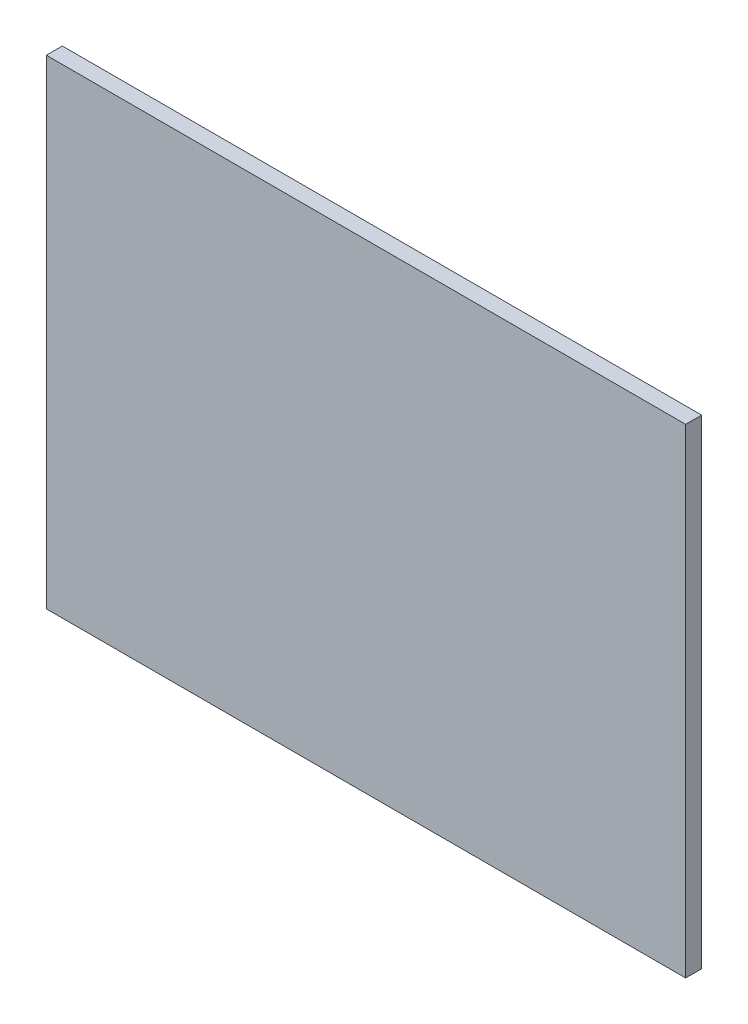
ISO-10303-21;
HEADER;
FILE_DESCRIPTION(('STEP AP214'),'2;1');
FILE_NAME('part.step','',(''),(''),'','','');
FILE_SCHEMA(('AUTOMOTIVE_DESIGN { 1 0 10303 214 1 1 1 1 }'));
ENDSEC;
DATA;
#1=APPLICATION_CONTEXT('core data for automotive mechanical design processes');
#2=APPLICATION_PROTOCOL_DEFINITION('international standard','automotive_design',2000,#1);
#3=PRODUCT_CONTEXT('',#1,'mechanical');
#4=PRODUCT('Part','Part','',(#3));
#5=PRODUCT_RELATED_PRODUCT_CATEGORY('part','',(#4));
#6=PRODUCT_DEFINITION_FORMATION('','',#4);
#7=PRODUCT_DEFINITION_CONTEXT('part definition',#1,'design');
#8=PRODUCT_DEFINITION('design','',#6,#7);
#9=PRODUCT_DEFINITION_SHAPE('','',#8);
#10=(LENGTH_UNIT() NAMED_UNIT(*) SI_UNIT(.MILLI.,.METRE.));
#11=(NAMED_UNIT(*) PLANE_ANGLE_UNIT() SI_UNIT($,.RADIAN.));
#12=(NAMED_UNIT(*) SI_UNIT($,.STERADIAN.) SOLID_ANGLE_UNIT());
#13=UNCERTAINTY_MEASURE_WITH_UNIT(LENGTH_MEASURE(1.E-05),#10,'distance_accuracy_value','');
#14=(GEOMETRIC_REPRESENTATION_CONTEXT(3) GLOBAL_UNCERTAINTY_ASSIGNED_CONTEXT((#13)) GLOBAL_UNIT_ASSIGNED_CONTEXT((#10,
#11,#12)) REPRESENTATION_CONTEXT('',''));
#15=CARTESIAN_POINT('',(0.,0.,0.));
#16=DIRECTION('',(0.,0.,1.));
#17=DIRECTION('',(1.,0.,0.));
#18=AXIS2_PLACEMENT_3D('',#15,#16,#17);
#19=CARTESIAN_POINT('',(-28.,-21.,-1.7));
#20=DIRECTION('',(0.,-1.,0.));
#21=DIRECTION('',(1.,0.,0.));
#22=AXIS2_PLACEMENT_3D('',#19,#20,#21);
#23=PLANE('',#22);
#24=DIRECTION('',(1.,0.,0.));
#25=VECTOR('',#24,1.);
#26=CARTESIAN_POINT('',(-28.,-21.,-0.3));
#27=LINE('',#26,#25);
#28=CARTESIAN_POINT('',(-28.,-21.,-0.3));
#29=VERTEX_POINT('',#28);
#30=CARTESIAN_POINT('',(28.,-21.,-0.3));
#31=VERTEX_POINT('',#30);
#32=EDGE_CURVE('E106',#29,#31,#27,.T.);
#33=ORIENTED_EDGE('',*,*,#32,.F.);
#34=DIRECTION('',(0.,0.,1.));
#35=VECTOR('',#34,1.);
#36=CARTESIAN_POINT('',(-28.,-21.,-1.7));
#37=LINE('',#36,#35);
#38=CARTESIAN_POINT('',(-28.,-21.,-1.7));
#39=VERTEX_POINT('',#38);
#40=EDGE_CURVE('E12',#39,#29,#37,.T.);
#41=ORIENTED_EDGE('',*,*,#40,.F.);
#42=DIRECTION('',(1.,0.,0.));
#43=VECTOR('',#42,1.);
#44=CARTESIAN_POINT('',(-28.,-21.,-1.7));
#45=LINE('',#44,#43);
#46=CARTESIAN_POINT('',(28.,-21.,-1.7));
#47=VERTEX_POINT('',#46);
#48=EDGE_CURVE('E101',#39,#47,#45,.T.);
#49=ORIENTED_EDGE('',*,*,#48,.T.);
#50=DIRECTION('',(0.,0.,1.));
#51=VECTOR('',#50,1.);
#52=CARTESIAN_POINT('',(28.,-21.,-1.7));
#53=LINE('',#52,#51);
#54=EDGE_CURVE('E44',#47,#31,#53,.T.);
#55=ORIENTED_EDGE('',*,*,#54,.T.);
#56=EDGE_LOOP('',(#33,#41,#49,#55));
#57=FACE_BOUND('',#56,.T.);
#58=ADVANCED_FACE('F41',(#57),#23,.T.);
#59=CARTESIAN_POINT('',(-28.,-21.,-1.7));
#60=DIRECTION('',(1.,0.,0.));
#61=DIRECTION('',(0.,0.,-1.));
#62=AXIS2_PLACEMENT_3D('',#59,#60,#61);
#63=PLANE('',#62);
#64=DIRECTION('',(0.,1.,0.));
#65=VECTOR('',#64,1.);
#66=CARTESIAN_POINT('',(-28.,-21.,-0.3));
#67=LINE('',#66,#65);
#68=CARTESIAN_POINT('',(-28.,21.,-0.3));
#69=VERTEX_POINT('',#68);
#70=EDGE_CURVE('E74',#29,#69,#67,.T.);
#71=ORIENTED_EDGE('',*,*,#70,.T.);
#72=DIRECTION('',(0.,0.,1.));
#73=VECTOR('',#72,1.);
#74=CARTESIAN_POINT('',(-28.,21.,-1.7));
#75=LINE('',#74,#73);
#76=CARTESIAN_POINT('',(-28.,21.,-1.7));
#77=VERTEX_POINT('',#76);
#78=EDGE_CURVE('E50',#77,#69,#75,.T.);
#79=ORIENTED_EDGE('',*,*,#78,.F.);
#80=DIRECTION('',(0.,1.,0.));
#81=VECTOR('',#80,1.);
#82=CARTESIAN_POINT('',(-28.,-21.,-1.7));
#83=LINE('',#82,#81);
#84=EDGE_CURVE('E91',#39,#77,#83,.T.);
#85=ORIENTED_EDGE('',*,*,#84,.F.);
#86=ORIENTED_EDGE('',*,*,#40,.T.);
#87=EDGE_LOOP('',(#71,#79,#85,#86));
#88=FACE_BOUND('',#87,.T.);
#89=ADVANCED_FACE('F116',(#88),#63,.F.);
#90=CARTESIAN_POINT('',(-28.,21.,-1.7));
#91=DIRECTION('',(0.,-1.,0.));
#92=DIRECTION('',(0.,0.,-1.));
#93=AXIS2_PLACEMENT_3D('',#90,#91,#92);
#94=PLANE('',#93);
#95=DIRECTION('',(1.,0.,0.));
#96=VECTOR('',#95,1.);
#97=CARTESIAN_POINT('',(-28.,21.,-0.3));
#98=LINE('',#97,#96);
#99=CARTESIAN_POINT('',(28.,21.,-0.3));
#100=VERTEX_POINT('',#99);
#101=EDGE_CURVE('E98',#69,#100,#98,.T.);
#102=ORIENTED_EDGE('',*,*,#101,.T.);
#103=DIRECTION('',(0.,0.,1.));
#104=VECTOR('',#103,1.);
#105=CARTESIAN_POINT('',(28.,21.,-1.7));
#106=LINE('',#105,#104);
#107=CARTESIAN_POINT('',(28.,21.,-1.7));
#108=VERTEX_POINT('',#107);
#109=EDGE_CURVE('E95',#108,#100,#106,.T.);
#110=ORIENTED_EDGE('',*,*,#109,.F.);
#111=DIRECTION('',(1.,0.,0.));
#112=VECTOR('',#111,1.);
#113=CARTESIAN_POINT('',(-28.,21.,-1.7));
#114=LINE('',#113,#112);
#115=EDGE_CURVE('E86',#77,#108,#114,.T.);
#116=ORIENTED_EDGE('',*,*,#115,.F.);
#117=ORIENTED_EDGE('',*,*,#78,.T.);
#118=EDGE_LOOP('',(#102,#110,#116,#117));
#119=FACE_BOUND('',#118,.T.);
#120=ADVANCED_FACE('F96',(#119),#94,.F.);
#121=CARTESIAN_POINT('',(28.,-21.,-1.7));
#122=DIRECTION('',(1.,0.,0.));
#123=DIRECTION('',(0.,0.,-1.));
#124=AXIS2_PLACEMENT_3D('',#121,#122,#123);
#125=PLANE('',#124);
#126=DIRECTION('',(0.,1.,0.));
#127=VECTOR('',#126,1.);
#128=CARTESIAN_POINT('',(28.,-21.,-0.3));
#129=LINE('',#128,#127);
#130=EDGE_CURVE('E109',#31,#100,#129,.T.);
#131=ORIENTED_EDGE('',*,*,#130,.F.);
#132=ORIENTED_EDGE('',*,*,#54,.F.);
#133=DIRECTION('',(0.,1.,0.));
#134=VECTOR('',#133,1.);
#135=CARTESIAN_POINT('',(28.,-21.,-1.7));
#136=LINE('',#135,#134);
#137=EDGE_CURVE('E90',#47,#108,#136,.T.);
#138=ORIENTED_EDGE('',*,*,#137,.T.);
#139=ORIENTED_EDGE('',*,*,#109,.T.);
#140=EDGE_LOOP('',(#131,#132,#138,#139));
#141=FACE_BOUND('',#140,.T.);
#142=ADVANCED_FACE('F100',(#141),#125,.T.);
#143=CARTESIAN_POINT('',(0.,0.,-1.7));
#144=DIRECTION('',(0.,0.,1.));
#145=DIRECTION('',(1.,0.,0.));
#146=AXIS2_PLACEMENT_3D('',#143,#144,#145);
#147=PLANE('',#146);
#148=ORIENTED_EDGE('',*,*,#48,.F.);
#149=ORIENTED_EDGE('',*,*,#84,.T.);
#150=ORIENTED_EDGE('',*,*,#115,.T.);
#151=ORIENTED_EDGE('',*,*,#137,.F.);
#152=EDGE_LOOP('',(#148,#149,#150,#151));
#153=FACE_BOUND('',#152,.T.);
#154=ADVANCED_FACE('F89',(#153),#147,.F.);
#155=CARTESIAN_POINT('',(0.,0.,-0.3));
#156=DIRECTION('',(0.,0.,1.));
#157=DIRECTION('',(1.,0.,0.));
#158=AXIS2_PLACEMENT_3D('',#155,#156,#157);
#159=PLANE('',#158);
#160=ORIENTED_EDGE('',*,*,#32,.T.);
#161=ORIENTED_EDGE('',*,*,#130,.T.);
#162=ORIENTED_EDGE('',*,*,#101,.F.);
#163=ORIENTED_EDGE('',*,*,#70,.F.);
#164=EDGE_LOOP('',(#160,#161,#162,#163));
#165=FACE_BOUND('',#164,.T.);
#166=ADVANCED_FACE('F114',(#165),#159,.T.);
#167=CLOSED_SHELL('',(#58,#89,#120,#142,#154,#166));
#168=MANIFOLD_SOLID_BREP('B2',#167);
#169=ADVANCED_BREP_SHAPE_REPRESENTATION('',(#18,#168),#14);
#170=SHAPE_DEFINITION_REPRESENTATION(#9,#169);
ENDSEC;
END-ISO-10303-21;
